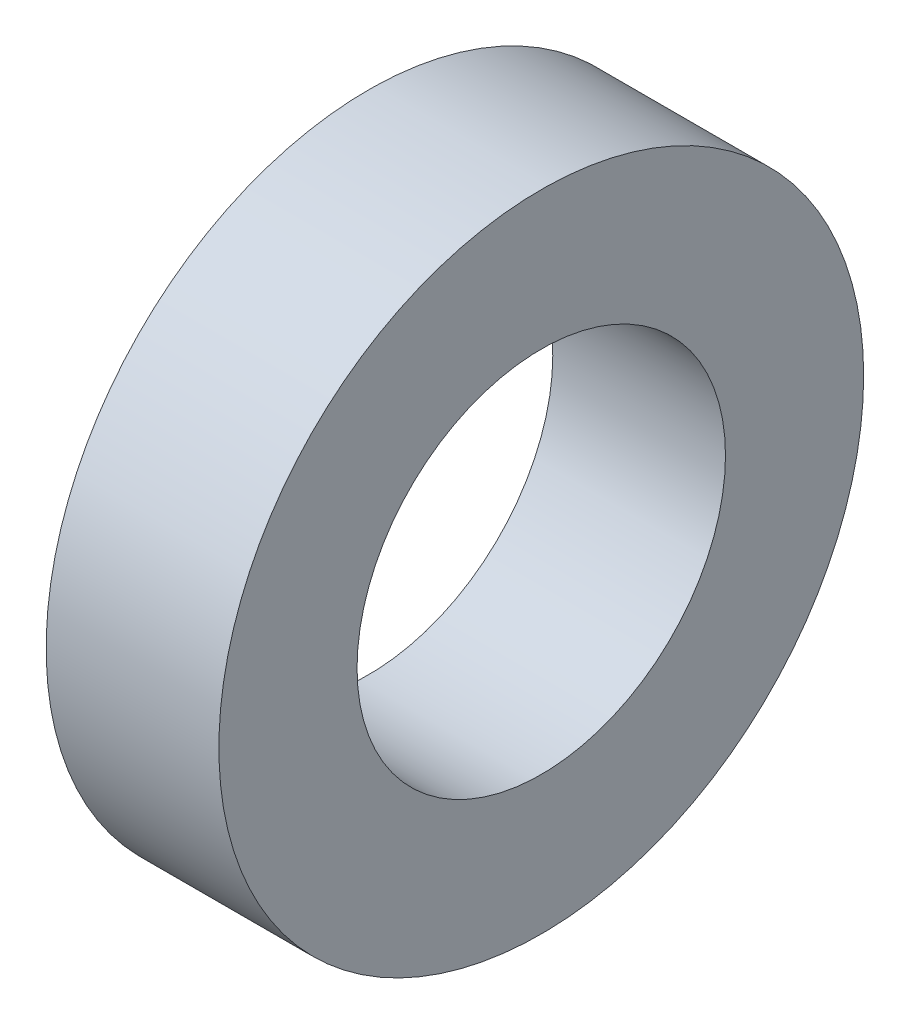
ISO-10303-21;
HEADER;
FILE_DESCRIPTION(('STEP AP214'),'2;1');
FILE_NAME('part.step','',(''),(''),'','','');
FILE_SCHEMA(('AUTOMOTIVE_DESIGN { 1 0 10303 214 1 1 1 1 }'));
ENDSEC;
DATA;
#1=APPLICATION_CONTEXT('core data for automotive mechanical design processes');
#2=APPLICATION_PROTOCOL_DEFINITION('international standard','automotive_design',2000,#1);
#3=PRODUCT_CONTEXT('',#1,'mechanical');
#4=PRODUCT('Part','Part','',(#3));
#5=PRODUCT_RELATED_PRODUCT_CATEGORY('part','',(#4));
#6=PRODUCT_DEFINITION_FORMATION('','',#4);
#7=PRODUCT_DEFINITION_CONTEXT('part definition',#1,'design');
#8=PRODUCT_DEFINITION('design','',#6,#7);
#9=PRODUCT_DEFINITION_SHAPE('','',#8);
#10=(LENGTH_UNIT() NAMED_UNIT(*) SI_UNIT(.MILLI.,.METRE.));
#11=(NAMED_UNIT(*) PLANE_ANGLE_UNIT() SI_UNIT($,.RADIAN.));
#12=(NAMED_UNIT(*) SI_UNIT($,.STERADIAN.) SOLID_ANGLE_UNIT());
#13=UNCERTAINTY_MEASURE_WITH_UNIT(LENGTH_MEASURE(1.E-05),#10,'distance_accuracy_value','');
#14=(GEOMETRIC_REPRESENTATION_CONTEXT(3) GLOBAL_UNCERTAINTY_ASSIGNED_CONTEXT((#13)) GLOBAL_UNIT_ASSIGNED_CONTEXT((#10,
#11,#12)) REPRESENTATION_CONTEXT('',''));
#15=CARTESIAN_POINT('',(0.,0.,0.));
#16=DIRECTION('',(0.,0.,1.));
#17=DIRECTION('',(1.,0.,0.));
#18=AXIS2_PLACEMENT_3D('',#15,#16,#17);
#19=CARTESIAN_POINT('',(13.2,48.4467412045859,37.2747474683058));
#20=DIRECTION('',(1.,0.,0.));
#21=DIRECTION('',(0.,0.,-1.));
#22=AXIS2_PLACEMENT_3D('',#19,#20,#21);
#23=PLANE('',#22);
#24=CARTESIAN_POINT('',(13.2,48.4467412045859,37.2747474683058));
#25=DIRECTION('',(1.,0.,0.));
#26=DIRECTION('',(0.,0.,-1.));
#27=AXIS2_PLACEMENT_3D('',#24,#25,#26);
#28=CIRCLE('',#27,2.8);
#29=CARTESIAN_POINT('',(13.2,48.4467412045859,34.4747474683058));
#30=VERTEX_POINT('',#29);
#31=EDGE_CURVE('E10',#30,#30,#28,.T.);
#32=ORIENTED_EDGE('',*,*,#31,.T.);
#33=EDGE_LOOP('',(#32));
#34=FACE_BOUND('',#33,.T.);
#35=CARTESIAN_POINT('',(13.2,48.4467412045859,37.2747474683058));
#36=DIRECTION('',(1.,0.,0.));
#37=DIRECTION('',(0.,0.,-1.));
#38=AXIS2_PLACEMENT_3D('',#35,#36,#37);
#39=CIRCLE('',#38,1.6);
#40=CARTESIAN_POINT('',(13.2,48.4467412045859,35.6747474683058));
#41=VERTEX_POINT('',#40);
#42=EDGE_CURVE('E47',#41,#41,#39,.T.);
#43=ORIENTED_EDGE('',*,*,#42,.F.);
#44=EDGE_LOOP('',(#43));
#45=FACE_BOUND('',#44,.T.);
#46=ADVANCED_FACE('F36',(#34,#45),#23,.T.);
#47=CARTESIAN_POINT('',(11.7,48.4467412045859,37.2747474683058));
#48=DIRECTION('',(1.,0.,0.));
#49=DIRECTION('',(0.,0.,-1.));
#50=AXIS2_PLACEMENT_3D('',#47,#48,#49);
#51=PLANE('',#50);
#52=CARTESIAN_POINT('',(11.7,48.4467412045859,37.2747474683058));
#53=DIRECTION('',(1.,0.,0.));
#54=DIRECTION('',(0.,0.,-1.));
#55=AXIS2_PLACEMENT_3D('',#52,#53,#54);
#56=CIRCLE('',#55,2.8);
#57=CARTESIAN_POINT('',(11.7,48.4467412045859,34.4747474683058));
#58=VERTEX_POINT('',#57);
#59=EDGE_CURVE('E40',#58,#58,#56,.T.);
#60=ORIENTED_EDGE('',*,*,#59,.F.);
#61=EDGE_LOOP('',(#60));
#62=FACE_BOUND('',#61,.T.);
#63=CARTESIAN_POINT('',(11.7,48.4467412045859,37.2747474683058));
#64=DIRECTION('',(1.,0.,0.));
#65=DIRECTION('',(0.,0.,-1.));
#66=AXIS2_PLACEMENT_3D('',#63,#64,#65);
#67=CIRCLE('',#66,1.6);
#68=CARTESIAN_POINT('',(11.7,48.4467412045859,35.6747474683058));
#69=VERTEX_POINT('',#68);
#70=EDGE_CURVE('E49',#69,#69,#67,.T.);
#71=ORIENTED_EDGE('',*,*,#70,.T.);
#72=EDGE_LOOP('',(#71));
#73=FACE_BOUND('',#72,.T.);
#74=ADVANCED_FACE('F59',(#62,#73),#51,.F.);
#75=CARTESIAN_POINT('',(13.2,48.4467412045859,37.2747474683058));
#76=DIRECTION('',(-1.,0.,0.));
#77=DIRECTION('',(0.,0.,1.));
#78=AXIS2_PLACEMENT_3D('',#75,#76,#77);
#79=CYLINDRICAL_SURFACE('',#78,2.8);
#80=ORIENTED_EDGE('',*,*,#31,.F.);
#81=EDGE_LOOP('',(#80));
#82=FACE_BOUND('',#81,.T.);
#83=ORIENTED_EDGE('',*,*,#59,.T.);
#84=EDGE_LOOP('',(#83));
#85=FACE_BOUND('',#84,.T.);
#86=ADVANCED_FACE('F38',(#82,#85),#79,.T.);
#87=CARTESIAN_POINT('',(13.2,48.4467412045859,37.2747474683058));
#88=DIRECTION('',(-1.,0.,0.));
#89=DIRECTION('',(0.,0.,1.));
#90=AXIS2_PLACEMENT_3D('',#87,#88,#89);
#91=CYLINDRICAL_SURFACE('',#90,1.6);
#92=ORIENTED_EDGE('',*,*,#42,.T.);
#93=EDGE_LOOP('',(#92));
#94=FACE_BOUND('',#93,.T.);
#95=ORIENTED_EDGE('',*,*,#70,.F.);
#96=EDGE_LOOP('',(#95));
#97=FACE_BOUND('',#96,.T.);
#98=ADVANCED_FACE('F55',(#94,#97),#91,.F.);
#99=CLOSED_SHELL('',(#46,#74,#86,#98));
#100=MANIFOLD_SOLID_BREP('B2',#99);
#101=ADVANCED_BREP_SHAPE_REPRESENTATION('',(#18,#100),#14);
#102=SHAPE_DEFINITION_REPRESENTATION(#9,#101);
ENDSEC;
END-ISO-10303-21;
